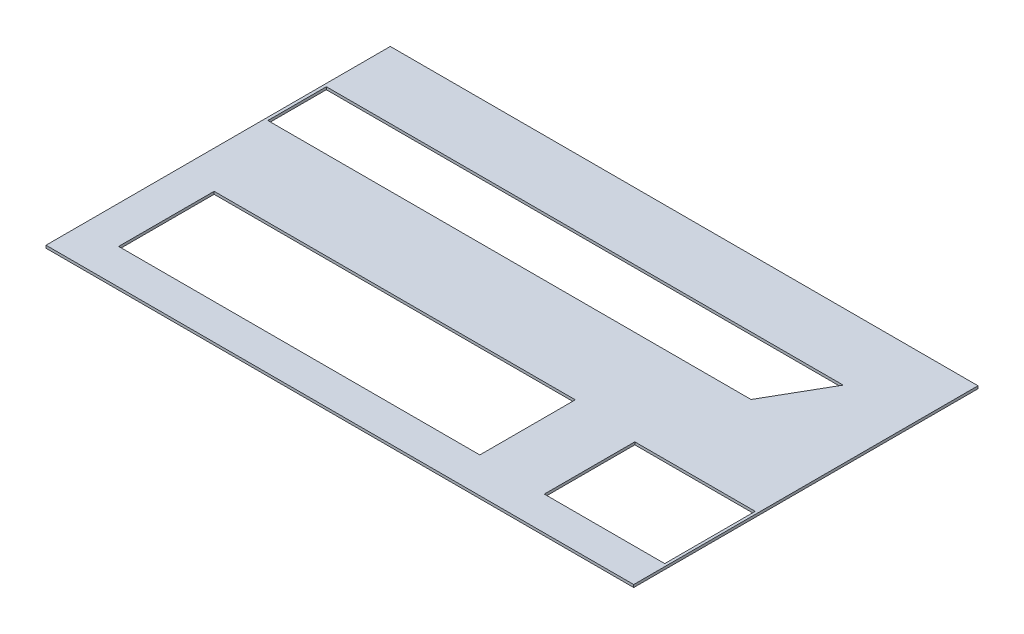
ISO-10303-21;
HEADER;
FILE_DESCRIPTION(('STEP AP214'),'2;1');
FILE_NAME('part.step','',(''),(''),'','','');
FILE_SCHEMA(('AUTOMOTIVE_DESIGN { 1 0 10303 214 1 1 1 1 }'));
ENDSEC;
DATA;
#1=APPLICATION_CONTEXT('core data for automotive mechanical design processes');
#2=APPLICATION_PROTOCOL_DEFINITION('international standard','automotive_design',2000,#1);
#3=PRODUCT_CONTEXT('',#1,'mechanical');
#4=PRODUCT('Part','Part','',(#3));
#5=PRODUCT_RELATED_PRODUCT_CATEGORY('part','',(#4));
#6=PRODUCT_DEFINITION_FORMATION('','',#4);
#7=PRODUCT_DEFINITION_CONTEXT('part definition',#1,'design');
#8=PRODUCT_DEFINITION('design','',#6,#7);
#9=PRODUCT_DEFINITION_SHAPE('','',#8);
#10=(LENGTH_UNIT() NAMED_UNIT(*) SI_UNIT(.MILLI.,.METRE.));
#11=(NAMED_UNIT(*) PLANE_ANGLE_UNIT() SI_UNIT($,.RADIAN.));
#12=(NAMED_UNIT(*) SI_UNIT($,.STERADIAN.) SOLID_ANGLE_UNIT());
#13=UNCERTAINTY_MEASURE_WITH_UNIT(LENGTH_MEASURE(1.E-05),#10,'distance_accuracy_value','');
#14=(GEOMETRIC_REPRESENTATION_CONTEXT(3) GLOBAL_UNCERTAINTY_ASSIGNED_CONTEXT((#13)) GLOBAL_UNIT_ASSIGNED_CONTEXT((#10,
#11,#12)) REPRESENTATION_CONTEXT('',''));
#15=CARTESIAN_POINT('',(0.,0.,0.));
#16=DIRECTION('',(0.,0.,1.));
#17=DIRECTION('',(1.,0.,0.));
#18=AXIS2_PLACEMENT_3D('',#15,#16,#17);
#19=CARTESIAN_POINT('',(0.,6.35,0.));
#20=DIRECTION('',(1.,0.,0.));
#21=DIRECTION('',(0.,0.,-1.));
#22=AXIS2_PLACEMENT_3D('',#19,#20,#21);
#23=PLANE('',#22);
#24=DIRECTION('',(0.,0.,1.));
#25=VECTOR('',#24,1.);
#26=CARTESIAN_POINT('',(0.,0.,0.));
#27=LINE('',#26,#25);
#28=CARTESIAN_POINT('',(0.,0.,-829.31));
#29=VERTEX_POINT('',#28);
#30=CARTESIAN_POINT('',(0.,0.,0.));
#31=VERTEX_POINT('',#30);
#32=EDGE_CURVE('E248',#29,#31,#27,.T.);
#33=ORIENTED_EDGE('',*,*,#32,.T.);
#34=DIRECTION('',(0.,-1.,0.));
#35=VECTOR('',#34,1.);
#36=CARTESIAN_POINT('',(0.,6.35,0.));
#37=LINE('',#36,#35);
#38=CARTESIAN_POINT('',(0.,6.35,0.));
#39=VERTEX_POINT('',#38);
#40=EDGE_CURVE('E11',#39,#31,#37,.T.);
#41=ORIENTED_EDGE('',*,*,#40,.F.);
#42=DIRECTION('',(0.,0.,1.));
#43=VECTOR('',#42,1.);
#44=CARTESIAN_POINT('',(0.,6.35,0.));
#45=LINE('',#44,#43);
#46=CARTESIAN_POINT('',(0.,6.35,-829.31));
#47=VERTEX_POINT('',#46);
#48=EDGE_CURVE('E249',#47,#39,#45,.T.);
#49=ORIENTED_EDGE('',*,*,#48,.F.);
#50=DIRECTION('',(0.,-1.,0.));
#51=VECTOR('',#50,1.);
#52=CARTESIAN_POINT('',(0.,6.35,-829.31));
#53=LINE('',#52,#51);
#54=EDGE_CURVE('E259',#47,#29,#53,.T.);
#55=ORIENTED_EDGE('',*,*,#54,.T.);
#56=EDGE_LOOP('',(#33,#41,#49,#55));
#57=FACE_BOUND('',#56,.T.);
#58=ADVANCED_FACE('F39',(#57),#23,.F.);
#59=CARTESIAN_POINT('',(0.,6.35,0.));
#60=DIRECTION('',(0.,0.,-1.));
#61=DIRECTION('',(-1.,0.,0.));
#62=AXIS2_PLACEMENT_3D('',#59,#60,#61);
#63=PLANE('',#62);
#64=DIRECTION('',(1.,0.,0.));
#65=VECTOR('',#64,1.);
#66=CARTESIAN_POINT('',(0.,0.,0.));
#67=LINE('',#66,#65);
#68=CARTESIAN_POINT('',(1415.68,0.,0.));
#69=VERTEX_POINT('',#68);
#70=EDGE_CURVE('E262',#31,#69,#67,.T.);
#71=ORIENTED_EDGE('',*,*,#70,.T.);
#72=DIRECTION('',(0.,-1.,0.));
#73=VECTOR('',#72,1.);
#74=CARTESIAN_POINT('',(1415.68,6.35,0.));
#75=LINE('',#74,#73);
#76=CARTESIAN_POINT('',(1415.68,6.35,0.));
#77=VERTEX_POINT('',#76);
#78=EDGE_CURVE('E46',#77,#69,#75,.T.);
#79=ORIENTED_EDGE('',*,*,#78,.F.);
#80=DIRECTION('',(1.,0.,0.));
#81=VECTOR('',#80,1.);
#82=CARTESIAN_POINT('',(0.,6.35,0.));
#83=LINE('',#82,#81);
#84=EDGE_CURVE('E252',#39,#77,#83,.T.);
#85=ORIENTED_EDGE('',*,*,#84,.F.);
#86=ORIENTED_EDGE('',*,*,#40,.T.);
#87=EDGE_LOOP('',(#71,#79,#85,#86));
#88=FACE_BOUND('',#87,.T.);
#89=ADVANCED_FACE('F291',(#88),#63,.F.);
#90=CARTESIAN_POINT('',(1415.68,6.35,0.));
#91=DIRECTION('',(-1.,0.,0.));
#92=DIRECTION('',(0.,0.,1.));
#93=AXIS2_PLACEMENT_3D('',#90,#91,#92);
#94=PLANE('',#93);
#95=DIRECTION('',(0.,0.,-1.));
#96=VECTOR('',#95,1.);
#97=CARTESIAN_POINT('',(1415.68,0.,0.));
#98=LINE('',#97,#96);
#99=CARTESIAN_POINT('',(1415.68,0.,-829.31));
#100=VERTEX_POINT('',#99);
#101=EDGE_CURVE('E264',#69,#100,#98,.T.);
#102=ORIENTED_EDGE('',*,*,#101,.T.);
#103=DIRECTION('',(0.,-1.,0.));
#104=VECTOR('',#103,1.);
#105=CARTESIAN_POINT('',(1415.68,6.35,-829.31));
#106=LINE('',#105,#104);
#107=CARTESIAN_POINT('',(1415.68,6.35,-829.31));
#108=VERTEX_POINT('',#107);
#109=EDGE_CURVE('E269',#108,#100,#106,.T.);
#110=ORIENTED_EDGE('',*,*,#109,.F.);
#111=DIRECTION('',(0.,0.,-1.));
#112=VECTOR('',#111,1.);
#113=CARTESIAN_POINT('',(1415.68,6.35,0.));
#114=LINE('',#113,#112);
#115=EDGE_CURVE('E255',#77,#108,#114,.T.);
#116=ORIENTED_EDGE('',*,*,#115,.F.);
#117=ORIENTED_EDGE('',*,*,#78,.T.);
#118=EDGE_LOOP('',(#102,#110,#116,#117));
#119=FACE_BOUND('',#118,.T.);
#120=ADVANCED_FACE('F276',(#119),#94,.F.);
#121=CARTESIAN_POINT('',(0.,6.35,-829.31));
#122=DIRECTION('',(0.,0.,1.));
#123=DIRECTION('',(1.,0.,0.));
#124=AXIS2_PLACEMENT_3D('',#121,#122,#123);
#125=PLANE('',#124);
#126=DIRECTION('',(-1.,0.,0.));
#127=VECTOR('',#126,1.);
#128=CARTESIAN_POINT('',(0.,0.,-829.31));
#129=LINE('',#128,#127);
#130=EDGE_CURVE('E253',#100,#29,#129,.T.);
#131=ORIENTED_EDGE('',*,*,#130,.T.);
#132=ORIENTED_EDGE('',*,*,#54,.F.);
#133=DIRECTION('',(-1.,0.,0.));
#134=VECTOR('',#133,1.);
#135=CARTESIAN_POINT('',(0.,6.35,-829.31));
#136=LINE('',#135,#134);
#137=EDGE_CURVE('E257',#108,#47,#136,.T.);
#138=ORIENTED_EDGE('',*,*,#137,.F.);
#139=ORIENTED_EDGE('',*,*,#109,.T.);
#140=EDGE_LOOP('',(#131,#132,#138,#139));
#141=FACE_BOUND('',#140,.T.);
#142=ADVANCED_FACE('F285',(#141),#125,.F.);
#143=CARTESIAN_POINT('',(0.,6.35,0.));
#144=DIRECTION('',(0.,-1.,0.));
#145=DIRECTION('',(0.,0.,-1.));
#146=AXIS2_PLACEMENT_3D('',#143,#144,#145);
#147=PLANE('',#146);
#148=DIRECTION('',(-1.,0.,0.));
#149=VECTOR('',#148,1.);
#150=CARTESIAN_POINT('',(1409.33,6.35,-299.));
#151=LINE('',#150,#149);
#152=CARTESIAN_POINT('',(1409.33,6.35,-299.));
#153=VERTEX_POINT('',#152);
#154=CARTESIAN_POINT('',(1119.33,6.35,-299.));
#155=VERTEX_POINT('',#154);
#156=EDGE_CURVE('E204',#153,#155,#151,.T.);
#157=ORIENTED_EDGE('',*,*,#156,.F.);
#158=DIRECTION('',(0.,0.,-1.));
#159=VECTOR('',#158,1.);
#160=CARTESIAN_POINT('',(1409.33,6.35,-299.));
#161=LINE('',#160,#159);
#162=CARTESIAN_POINT('',(1409.33,6.35,-81.));
#163=VERTEX_POINT('',#162);
#164=EDGE_CURVE('E53',#163,#153,#161,.T.);
#165=ORIENTED_EDGE('',*,*,#164,.F.);
#166=DIRECTION('',(1.,0.,0.));
#167=VECTOR('',#166,1.);
#168=CARTESIAN_POINT('',(1409.33,6.35,-81.));
#169=LINE('',#168,#167);
#170=CARTESIAN_POINT('',(1119.33,6.35,-81.));
#171=VERTEX_POINT('',#170);
#172=EDGE_CURVE('E193',#171,#163,#169,.T.);
#173=ORIENTED_EDGE('',*,*,#172,.F.);
#174=DIRECTION('',(0.,0.,1.));
#175=VECTOR('',#174,1.);
#176=CARTESIAN_POINT('',(1119.33,6.35,-299.));
#177=LINE('',#176,#175);
#178=EDGE_CURVE('E201',#155,#171,#177,.T.);
#179=ORIENTED_EDGE('',*,*,#178,.F.);
#180=EDGE_LOOP('',(#157,#165,#173,#179));
#181=FACE_BOUND('',#180,.T.);
#182=DIRECTION('',(1.,0.,0.));
#183=VECTOR('',#182,1.);
#184=CARTESIAN_POINT('',(7.00000000000002,6.35,-527.31));
#185=LINE('',#184,#183);
#186=CARTESIAN_POINT('',(7.00000000000002,6.35,-527.31));
#187=VERTEX_POINT('',#186);
#188=CARTESIAN_POINT('',(1171.,6.35,-527.31));
#189=VERTEX_POINT('',#188);
#190=EDGE_CURVE('E175',#187,#189,#185,.T.);
#191=ORIENTED_EDGE('',*,*,#190,.F.);
#192=DIRECTION('',(0.,0.,1.));
#193=VECTOR('',#192,1.);
#194=CARTESIAN_POINT('',(7.00000000000001,6.35,-668.31));
#195=LINE('',#194,#193);
#196=CARTESIAN_POINT('',(7.00000000000001,6.35,-668.31));
#197=VERTEX_POINT('',#196);
#198=EDGE_CURVE('E61',#197,#187,#195,.T.);
#199=ORIENTED_EDGE('',*,*,#198,.F.);
#200=DIRECTION('',(-1.,0.,0.));
#201=VECTOR('',#200,1.);
#202=CARTESIAN_POINT('',(7.00000000000001,6.35,-668.31));
#203=LINE('',#202,#201);
#204=CARTESIAN_POINT('',(1252.,6.35,-668.31));
#205=VERTEX_POINT('',#204);
#206=EDGE_CURVE('E162',#205,#197,#203,.T.);
#207=ORIENTED_EDGE('',*,*,#206,.F.);
#208=DIRECTION('',(0.498124460568315,0.,-0.867105542470768));
#209=VECTOR('',#208,1.);
#210=CARTESIAN_POINT('',(1252.,6.35,-668.31));
#211=LINE('',#210,#209);
#212=EDGE_CURVE('E168',#189,#205,#211,.T.);
#213=ORIENTED_EDGE('',*,*,#212,.F.);
#214=EDGE_LOOP('',(#191,#199,#207,#213));
#215=FACE_BOUND('',#214,.T.);
#216=DIRECTION('',(1.,0.,0.));
#217=VECTOR('',#216,1.);
#218=CARTESIAN_POINT('',(89.9999999999999,6.35,-85.));
#219=LINE('',#218,#217);
#220=CARTESIAN_POINT('',(89.9999999999999,6.35,-85.));
#221=VERTEX_POINT('',#220);
#222=CARTESIAN_POINT('',(960.,6.35,-85.));
#223=VERTEX_POINT('',#222);
#224=EDGE_CURVE('E227',#221,#223,#219,.T.);
#225=ORIENTED_EDGE('',*,*,#224,.F.);
#226=DIRECTION('',(0.,0.,1.));
#227=VECTOR('',#226,1.);
#228=CARTESIAN_POINT('',(89.9999999999999,6.35,-85.));
#229=LINE('',#228,#227);
#230=CARTESIAN_POINT('',(90.,6.35,-315.));
#231=VERTEX_POINT('',#230);
#232=EDGE_CURVE('E225',#231,#221,#229,.T.);
#233=ORIENTED_EDGE('',*,*,#232,.F.);
#234=DIRECTION('',(-1.,0.,0.));
#235=VECTOR('',#234,1.);
#236=CARTESIAN_POINT('',(90.,6.35,-315.));
#237=LINE('',#236,#235);
#238=CARTESIAN_POINT('',(960.,6.35,-315.));
#239=VERTEX_POINT('',#238);
#240=EDGE_CURVE('E233',#239,#231,#237,.T.);
#241=ORIENTED_EDGE('',*,*,#240,.F.);
#242=DIRECTION('',(0.,0.,-1.));
#243=VECTOR('',#242,1.);
#244=CARTESIAN_POINT('',(960.,6.35,-85.));
#245=LINE('',#244,#243);
#246=EDGE_CURVE('E230',#223,#239,#245,.T.);
#247=ORIENTED_EDGE('',*,*,#246,.F.);
#248=EDGE_LOOP('',(#225,#233,#241,#247));
#249=FACE_BOUND('',#248,.T.);
#250=ORIENTED_EDGE('',*,*,#48,.T.);
#251=ORIENTED_EDGE('',*,*,#84,.T.);
#252=ORIENTED_EDGE('',*,*,#115,.T.);
#253=ORIENTED_EDGE('',*,*,#137,.T.);
#254=EDGE_LOOP('',(#250,#251,#252,#253));
#255=FACE_BOUND('',#254,.T.);
#256=ADVANCED_FACE('F172',(#181,#215,#249,#255),#147,.F.);
#257=CARTESIAN_POINT('',(0.,0.,0.));
#258=DIRECTION('',(0.,-1.,0.));
#259=DIRECTION('',(0.,0.,-1.));
#260=AXIS2_PLACEMENT_3D('',#257,#258,#259);
#261=PLANE('',#260);
#262=DIRECTION('',(0.,0.,-1.));
#263=VECTOR('',#262,1.);
#264=CARTESIAN_POINT('',(1409.33,0.,-299.));
#265=LINE('',#264,#263);
#266=CARTESIAN_POINT('',(1409.33,0.,-81.));
#267=VERTEX_POINT('',#266);
#268=CARTESIAN_POINT('',(1409.33,0.,-299.));
#269=VERTEX_POINT('',#268);
#270=EDGE_CURVE('E208',#267,#269,#265,.T.);
#271=ORIENTED_EDGE('',*,*,#270,.T.);
#272=DIRECTION('',(-1.,0.,0.));
#273=VECTOR('',#272,1.);
#274=CARTESIAN_POINT('',(1409.33,0.,-299.));
#275=LINE('',#274,#273);
#276=CARTESIAN_POINT('',(1119.33,0.,-299.));
#277=VERTEX_POINT('',#276);
#278=EDGE_CURVE('E187',#269,#277,#275,.T.);
#279=ORIENTED_EDGE('',*,*,#278,.T.);
#280=DIRECTION('',(0.,0.,1.));
#281=VECTOR('',#280,1.);
#282=CARTESIAN_POINT('',(1119.33,0.,-299.));
#283=LINE('',#282,#281);
#284=CARTESIAN_POINT('',(1119.33,0.,-81.));
#285=VERTEX_POINT('',#284);
#286=EDGE_CURVE('E214',#277,#285,#283,.T.);
#287=ORIENTED_EDGE('',*,*,#286,.T.);
#288=DIRECTION('',(1.,0.,0.));
#289=VECTOR('',#288,1.);
#290=CARTESIAN_POINT('',(1409.33,0.,-81.));
#291=LINE('',#290,#289);
#292=EDGE_CURVE('E211',#285,#267,#291,.T.);
#293=ORIENTED_EDGE('',*,*,#292,.T.);
#294=EDGE_LOOP('',(#271,#279,#287,#293));
#295=FACE_BOUND('',#294,.T.);
#296=DIRECTION('',(0.,0.,1.));
#297=VECTOR('',#296,1.);
#298=CARTESIAN_POINT('',(7.00000000000001,0.,-668.31));
#299=LINE('',#298,#297);
#300=CARTESIAN_POINT('',(7.00000000000001,0.,-668.31));
#301=VERTEX_POINT('',#300);
#302=CARTESIAN_POINT('',(7.00000000000002,0.,-527.31));
#303=VERTEX_POINT('',#302);
#304=EDGE_CURVE('E155',#301,#303,#299,.T.);
#305=ORIENTED_EDGE('',*,*,#304,.T.);
#306=DIRECTION('',(1.,0.,0.));
#307=VECTOR('',#306,1.);
#308=CARTESIAN_POINT('',(7.00000000000002,0.,-527.31));
#309=LINE('',#308,#307);
#310=CARTESIAN_POINT('',(1171.,0.,-527.31));
#311=VERTEX_POINT('',#310);
#312=EDGE_CURVE('E159',#303,#311,#309,.T.);
#313=ORIENTED_EDGE('',*,*,#312,.T.);
#314=DIRECTION('',(0.498124460568315,0.,-0.867105542470768));
#315=VECTOR('',#314,1.);
#316=CARTESIAN_POINT('',(1252.,0.,-668.31));
#317=LINE('',#316,#315);
#318=CARTESIAN_POINT('',(1252.,0.,-668.31));
#319=VERTEX_POINT('',#318);
#320=EDGE_CURVE('E183',#311,#319,#317,.T.);
#321=ORIENTED_EDGE('',*,*,#320,.T.);
#322=DIRECTION('',(-1.,0.,0.));
#323=VECTOR('',#322,1.);
#324=CARTESIAN_POINT('',(7.00000000000001,0.,-668.31));
#325=LINE('',#324,#323);
#326=EDGE_CURVE('E177',#319,#301,#325,.T.);
#327=ORIENTED_EDGE('',*,*,#326,.T.);
#328=EDGE_LOOP('',(#305,#313,#321,#327));
#329=FACE_BOUND('',#328,.T.);
#330=DIRECTION('',(0.,0.,1.));
#331=VECTOR('',#330,1.);
#332=CARTESIAN_POINT('',(89.9999999999999,0.,-85.));
#333=LINE('',#332,#331);
#334=CARTESIAN_POINT('',(90.,0.,-315.));
#335=VERTEX_POINT('',#334);
#336=CARTESIAN_POINT('',(89.9999999999999,0.,-85.));
#337=VERTEX_POINT('',#336);
#338=EDGE_CURVE('E222',#335,#337,#333,.T.);
#339=ORIENTED_EDGE('',*,*,#338,.T.);
#340=DIRECTION('',(1.,0.,0.));
#341=VECTOR('',#340,1.);
#342=CARTESIAN_POINT('',(89.9999999999999,0.,-85.));
#343=LINE('',#342,#341);
#344=CARTESIAN_POINT('',(960.,0.,-85.));
#345=VERTEX_POINT('',#344);
#346=EDGE_CURVE('E239',#337,#345,#343,.T.);
#347=ORIENTED_EDGE('',*,*,#346,.T.);
#348=DIRECTION('',(0.,0.,-1.));
#349=VECTOR('',#348,1.);
#350=CARTESIAN_POINT('',(960.,0.,-85.));
#351=LINE('',#350,#349);
#352=CARTESIAN_POINT('',(960.,0.,-315.));
#353=VERTEX_POINT('',#352);
#354=EDGE_CURVE('E186',#345,#353,#351,.T.);
#355=ORIENTED_EDGE('',*,*,#354,.T.);
#356=DIRECTION('',(-1.,0.,0.));
#357=VECTOR('',#356,1.);
#358=CARTESIAN_POINT('',(90.,0.,-315.));
#359=LINE('',#358,#357);
#360=EDGE_CURVE('E219',#353,#335,#359,.T.);
#361=ORIENTED_EDGE('',*,*,#360,.T.);
#362=EDGE_LOOP('',(#339,#347,#355,#361));
#363=FACE_BOUND('',#362,.T.);
#364=ORIENTED_EDGE('',*,*,#32,.F.);
#365=ORIENTED_EDGE('',*,*,#130,.F.);
#366=ORIENTED_EDGE('',*,*,#101,.F.);
#367=ORIENTED_EDGE('',*,*,#70,.F.);
#368=EDGE_LOOP('',(#364,#365,#366,#367));
#369=FACE_BOUND('',#368,.T.);
#370=ADVANCED_FACE('F282',(#295,#329,#363,#369),#261,.T.);
#371=CARTESIAN_POINT('',(89.9999999999999,-0.00100000000000013,-85.));
#372=DIRECTION('',(-1.,0.,0.));
#373=DIRECTION('',(0.,0.,1.));
#374=AXIS2_PLACEMENT_3D('',#371,#372,#373);
#375=PLANE('',#374);
#376=DIRECTION('',(0.,1.,0.));
#377=VECTOR('',#376,1.);
#378=CARTESIAN_POINT('',(90.,-0.00100000000000013,-315.));
#379=LINE('',#378,#377);
#380=EDGE_CURVE('E237',#335,#231,#379,.T.);
#381=ORIENTED_EDGE('',*,*,#380,.T.);
#382=ORIENTED_EDGE('',*,*,#232,.T.);
#383=DIRECTION('',(0.,1.,0.));
#384=VECTOR('',#383,1.);
#385=CARTESIAN_POINT('',(89.9999999999999,-0.00100000000000013,-85.));
#386=LINE('',#385,#384);
#387=EDGE_CURVE('E236',#337,#221,#386,.T.);
#388=ORIENTED_EDGE('',*,*,#387,.F.);
#389=ORIENTED_EDGE('',*,*,#338,.F.);
#390=EDGE_LOOP('',(#381,#382,#388,#389));
#391=FACE_BOUND('',#390,.T.);
#392=ADVANCED_FACE('F303',(#391),#375,.F.);
#393=CARTESIAN_POINT('',(90.,-0.00100000000000013,-315.));
#394=DIRECTION('',(0.,0.,-1.));
#395=DIRECTION('',(-1.,0.,0.));
#396=AXIS2_PLACEMENT_3D('',#393,#394,#395);
#397=PLANE('',#396);
#398=DIRECTION('',(0.,1.,0.));
#399=VECTOR('',#398,1.);
#400=CARTESIAN_POINT('',(960.,-0.00100000000000013,-315.));
#401=LINE('',#400,#399);
#402=EDGE_CURVE('E240',#353,#239,#401,.T.);
#403=ORIENTED_EDGE('',*,*,#402,.T.);
#404=ORIENTED_EDGE('',*,*,#240,.T.);
#405=ORIENTED_EDGE('',*,*,#380,.F.);
#406=ORIENTED_EDGE('',*,*,#360,.F.);
#407=EDGE_LOOP('',(#403,#404,#405,#406));
#408=FACE_BOUND('',#407,.T.);
#409=ADVANCED_FACE('F310',(#408),#397,.F.);
#410=CARTESIAN_POINT('',(960.,-0.00100000000000013,-85.));
#411=DIRECTION('',(1.,0.,0.));
#412=DIRECTION('',(0.,0.,-1.));
#413=AXIS2_PLACEMENT_3D('',#410,#411,#412);
#414=PLANE('',#413);
#415=DIRECTION('',(0.,1.,0.));
#416=VECTOR('',#415,1.);
#417=CARTESIAN_POINT('',(960.,-0.00100000000000013,-85.));
#418=LINE('',#417,#416);
#419=EDGE_CURVE('E242',#345,#223,#418,.T.);
#420=ORIENTED_EDGE('',*,*,#419,.T.);
#421=ORIENTED_EDGE('',*,*,#246,.T.);
#422=ORIENTED_EDGE('',*,*,#402,.F.);
#423=ORIENTED_EDGE('',*,*,#354,.F.);
#424=EDGE_LOOP('',(#420,#421,#422,#423));
#425=FACE_BOUND('',#424,.T.);
#426=ADVANCED_FACE('F315',(#425),#414,.F.);
#427=CARTESIAN_POINT('',(89.9999999999999,-0.00100000000000013,-85.));
#428=DIRECTION('',(0.,0.,1.));
#429=DIRECTION('',(1.,0.,0.));
#430=AXIS2_PLACEMENT_3D('',#427,#428,#429);
#431=PLANE('',#430);
#432=ORIENTED_EDGE('',*,*,#387,.T.);
#433=ORIENTED_EDGE('',*,*,#224,.T.);
#434=ORIENTED_EDGE('',*,*,#419,.F.);
#435=ORIENTED_EDGE('',*,*,#346,.F.);
#436=EDGE_LOOP('',(#432,#433,#434,#435));
#437=FACE_BOUND('',#436,.T.);
#438=ADVANCED_FACE('F312',(#437),#431,.F.);
#439=CARTESIAN_POINT('',(7.00000000000001,-0.00100000000000013,-668.31));
#440=DIRECTION('',(-1.,0.,0.));
#441=DIRECTION('',(0.,0.,1.));
#442=AXIS2_PLACEMENT_3D('',#439,#440,#441);
#443=PLANE('',#442);
#444=DIRECTION('',(0.,1.,0.));
#445=VECTOR('',#444,1.);
#446=CARTESIAN_POINT('',(7.00000000000001,-0.00100000000000013,-668.31));
#447=LINE('',#446,#445);
#448=EDGE_CURVE('E151',#301,#197,#447,.T.);
#449=ORIENTED_EDGE('',*,*,#448,.T.);
#450=ORIENTED_EDGE('',*,*,#198,.T.);
#451=DIRECTION('',(0.,1.,0.));
#452=VECTOR('',#451,1.);
#453=CARTESIAN_POINT('',(7.00000000000002,-0.00100000000000013,-527.31));
#454=LINE('',#453,#452);
#455=EDGE_CURVE('E169',#303,#187,#454,.T.);
#456=ORIENTED_EDGE('',*,*,#455,.F.);
#457=ORIENTED_EDGE('',*,*,#304,.F.);
#458=EDGE_LOOP('',(#449,#450,#456,#457));
#459=FACE_BOUND('',#458,.T.);
#460=ADVANCED_FACE('F153',(#459),#443,.F.);
#461=CARTESIAN_POINT('',(7.00000000000001,-0.00100000000000013,-668.31));
#462=DIRECTION('',(0.,0.,-1.));
#463=DIRECTION('',(-1.,0.,0.));
#464=AXIS2_PLACEMENT_3D('',#461,#462,#463);
#465=PLANE('',#464);
#466=DIRECTION('',(0.,1.,0.));
#467=VECTOR('',#466,1.);
#468=CARTESIAN_POINT('',(1252.,-0.00100000000000013,-668.31));
#469=LINE('',#468,#467);
#470=EDGE_CURVE('E158',#319,#205,#469,.T.);
#471=ORIENTED_EDGE('',*,*,#470,.T.);
#472=ORIENTED_EDGE('',*,*,#206,.T.);
#473=ORIENTED_EDGE('',*,*,#448,.F.);
#474=ORIENTED_EDGE('',*,*,#326,.F.);
#475=EDGE_LOOP('',(#471,#472,#473,#474));
#476=FACE_BOUND('',#475,.T.);
#477=ADVANCED_FACE('F163',(#476),#465,.F.);
#478=CARTESIAN_POINT('',(1252.,-0.00100000000000013,-668.31));
#479=DIRECTION('',(0.867105542470768,0.,0.498124460568315));
#480=DIRECTION('',(0.498124460568315,0.,-0.867105542470768));
#481=AXIS2_PLACEMENT_3D('',#478,#479,#480);
#482=PLANE('',#481);
#483=DIRECTION('',(0.,1.,0.));
#484=VECTOR('',#483,1.);
#485=CARTESIAN_POINT('',(1171.,-0.00100000000000013,-527.31));
#486=LINE('',#485,#484);
#487=EDGE_CURVE('E456',#311,#189,#486,.T.);
#488=ORIENTED_EDGE('',*,*,#487,.T.);
#489=ORIENTED_EDGE('',*,*,#212,.T.);
#490=ORIENTED_EDGE('',*,*,#470,.F.);
#491=ORIENTED_EDGE('',*,*,#320,.F.);
#492=EDGE_LOOP('',(#488,#489,#490,#491));
#493=FACE_BOUND('',#492,.T.);
#494=ADVANCED_FACE('F341',(#493),#482,.F.);
#495=CARTESIAN_POINT('',(7.00000000000002,-0.00100000000000013,-527.31));
#496=DIRECTION('',(0.,0.,1.));
#497=DIRECTION('',(1.,0.,0.));
#498=AXIS2_PLACEMENT_3D('',#495,#496,#497);
#499=PLANE('',#498);
#500=ORIENTED_EDGE('',*,*,#455,.T.);
#501=ORIENTED_EDGE('',*,*,#190,.T.);
#502=ORIENTED_EDGE('',*,*,#487,.F.);
#503=ORIENTED_EDGE('',*,*,#312,.F.);
#504=EDGE_LOOP('',(#500,#501,#502,#503));
#505=FACE_BOUND('',#504,.T.);
#506=ADVANCED_FACE('F338',(#505),#499,.F.);
#507=CARTESIAN_POINT('',(1409.33,-0.00100000000000013,-299.));
#508=DIRECTION('',(1.,0.,0.));
#509=DIRECTION('',(0.,0.,-1.));
#510=AXIS2_PLACEMENT_3D('',#507,#508,#509);
#511=PLANE('',#510);
#512=DIRECTION('',(0.,1.,0.));
#513=VECTOR('',#512,1.);
#514=CARTESIAN_POINT('',(1409.33,-0.00100000000000013,-81.));
#515=LINE('',#514,#513);
#516=EDGE_CURVE('E190',#267,#163,#515,.T.);
#517=ORIENTED_EDGE('',*,*,#516,.T.);
#518=ORIENTED_EDGE('',*,*,#164,.T.);
#519=DIRECTION('',(0.,1.,0.));
#520=VECTOR('',#519,1.);
#521=CARTESIAN_POINT('',(1409.33,-0.00100000000000013,-299.));
#522=LINE('',#521,#520);
#523=EDGE_CURVE('E191',#269,#153,#522,.T.);
#524=ORIENTED_EDGE('',*,*,#523,.F.);
#525=ORIENTED_EDGE('',*,*,#270,.F.);
#526=EDGE_LOOP('',(#517,#518,#524,#525));
#527=FACE_BOUND('',#526,.T.);
#528=ADVANCED_FACE('F327',(#527),#511,.F.);
#529=CARTESIAN_POINT('',(1409.33,-0.00100000000000013,-81.));
#530=DIRECTION('',(0.,0.,1.));
#531=DIRECTION('',(1.,0.,0.));
#532=AXIS2_PLACEMENT_3D('',#529,#530,#531);
#533=PLANE('',#532);
#534=DIRECTION('',(0.,1.,0.));
#535=VECTOR('',#534,1.);
#536=CARTESIAN_POINT('',(1119.33,-0.00100000000000013,-81.));
#537=LINE('',#536,#535);
#538=EDGE_CURVE('E196',#285,#171,#537,.T.);
#539=ORIENTED_EDGE('',*,*,#538,.T.);
#540=ORIENTED_EDGE('',*,*,#172,.T.);
#541=ORIENTED_EDGE('',*,*,#516,.F.);
#542=ORIENTED_EDGE('',*,*,#292,.F.);
#543=EDGE_LOOP('',(#539,#540,#541,#542));
#544=FACE_BOUND('',#543,.T.);
#545=ADVANCED_FACE('F323',(#544),#533,.F.);
#546=CARTESIAN_POINT('',(1119.33,-0.00100000000000013,-299.));
#547=DIRECTION('',(-1.,0.,0.));
#548=DIRECTION('',(0.,0.,1.));
#549=AXIS2_PLACEMENT_3D('',#546,#547,#548);
#550=PLANE('',#549);
#551=DIRECTION('',(0.,1.,0.));
#552=VECTOR('',#551,1.);
#553=CARTESIAN_POINT('',(1119.33,-0.00100000000000013,-299.));
#554=LINE('',#553,#552);
#555=EDGE_CURVE('E194',#277,#155,#554,.T.);
#556=ORIENTED_EDGE('',*,*,#555,.T.);
#557=ORIENTED_EDGE('',*,*,#178,.T.);
#558=ORIENTED_EDGE('',*,*,#538,.F.);
#559=ORIENTED_EDGE('',*,*,#286,.F.);
#560=EDGE_LOOP('',(#556,#557,#558,#559));
#561=FACE_BOUND('',#560,.T.);
#562=ADVANCED_FACE('F326',(#561),#550,.F.);
#563=CARTESIAN_POINT('',(1409.33,-0.00100000000000013,-299.));
#564=DIRECTION('',(0.,0.,-1.));
#565=DIRECTION('',(-1.,0.,0.));
#566=AXIS2_PLACEMENT_3D('',#563,#564,#565);
#567=PLANE('',#566);
#568=ORIENTED_EDGE('',*,*,#523,.T.);
#569=ORIENTED_EDGE('',*,*,#156,.T.);
#570=ORIENTED_EDGE('',*,*,#555,.F.);
#571=ORIENTED_EDGE('',*,*,#278,.F.);
#572=EDGE_LOOP('',(#568,#569,#570,#571));
#573=FACE_BOUND('',#572,.T.);
#574=ADVANCED_FACE('F331',(#573),#567,.F.);
#575=CLOSED_SHELL('',(#58,#89,#120,#142,#256,#370,#392,#409,#426,#438,#460,#477,#494,#506,#528,
#545,#562,#574));
#576=MANIFOLD_SOLID_BREP('B2',#575);
#577=ADVANCED_BREP_SHAPE_REPRESENTATION('',(#18,#576),#14);
#578=SHAPE_DEFINITION_REPRESENTATION(#9,#577);
ENDSEC;
END-ISO-10303-21;
